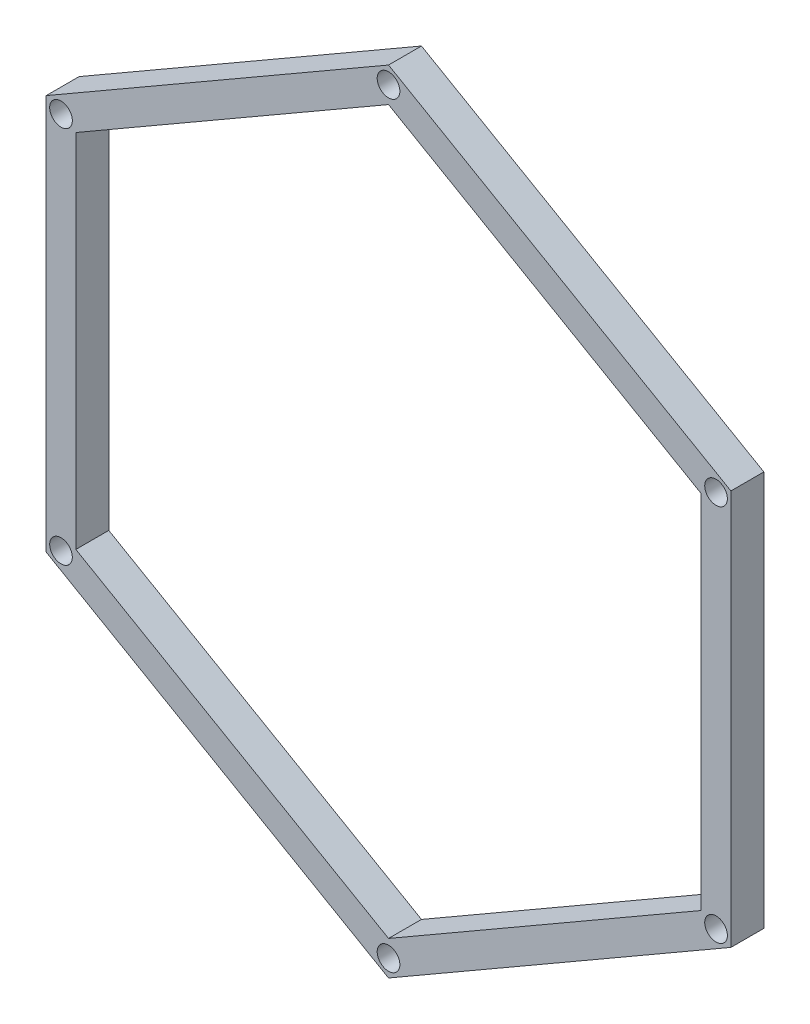
ISO-10303-21;
HEADER;
FILE_DESCRIPTION(('STEP AP214'),'2;1');
FILE_NAME('part.step','',(''),(''),'','','');
FILE_SCHEMA(('AUTOMOTIVE_DESIGN { 1 0 10303 214 1 1 1 1 }'));
ENDSEC;
DATA;
#1=APPLICATION_CONTEXT('core data for automotive mechanical design processes');
#2=APPLICATION_PROTOCOL_DEFINITION('international standard','automotive_design',2000,#1);
#3=PRODUCT_CONTEXT('',#1,'mechanical');
#4=PRODUCT('Part','Part','',(#3));
#5=PRODUCT_RELATED_PRODUCT_CATEGORY('part','',(#4));
#6=PRODUCT_DEFINITION_FORMATION('','',#4);
#7=PRODUCT_DEFINITION_CONTEXT('part definition',#1,'design');
#8=PRODUCT_DEFINITION('design','',#6,#7);
#9=PRODUCT_DEFINITION_SHAPE('','',#8);
#10=(LENGTH_UNIT() NAMED_UNIT(*) SI_UNIT(.MILLI.,.METRE.));
#11=(NAMED_UNIT(*) PLANE_ANGLE_UNIT() SI_UNIT($,.RADIAN.));
#12=(NAMED_UNIT(*) SI_UNIT($,.STERADIAN.) SOLID_ANGLE_UNIT());
#13=UNCERTAINTY_MEASURE_WITH_UNIT(LENGTH_MEASURE(1.E-05),#10,'distance_accuracy_value','');
#14=(GEOMETRIC_REPRESENTATION_CONTEXT(3) GLOBAL_UNCERTAINTY_ASSIGNED_CONTEXT((#13)) GLOBAL_UNIT_ASSIGNED_CONTEXT((#10,
#11,#12)) REPRESENTATION_CONTEXT('',''));
#15=CARTESIAN_POINT('',(0.,0.,0.));
#16=DIRECTION('',(0.,0.,1.));
#17=DIRECTION('',(1.,0.,0.));
#18=AXIS2_PLACEMENT_3D('',#15,#16,#17);
#19=CARTESIAN_POINT('',(0.,0.,3.175));
#20=DIRECTION('',(0.,0.,1.));
#21=DIRECTION('',(1.,0.,0.));
#22=AXIS2_PLACEMENT_3D('',#19,#20,#21);
#23=PLANE('',#22);
#24=CARTESIAN_POINT('',(0.,-36.449,3.175));
#25=DIRECTION('',(0.,0.,1.));
#26=DIRECTION('',(1.,0.,0.));
#27=AXIS2_PLACEMENT_3D('',#24,#25,#26);
#28=CIRCLE('',#27,1.0922);
#29=CARTESIAN_POINT('',(1.09220000000001,-36.449,3.175));
#30=VERTEX_POINT('',#29);
#31=EDGE_CURVE('E330',#30,#30,#28,.T.);
#32=ORIENTED_EDGE('',*,*,#31,.F.);
#33=EDGE_LOOP('',(#32));
#34=FACE_BOUND('',#33,.T.);
#35=CARTESIAN_POINT('',(31.565759942539,18.2245,3.175));
#36=DIRECTION('',(0.,0.,1.));
#37=DIRECTION('',(1.,0.,0.));
#38=AXIS2_PLACEMENT_3D('',#35,#36,#37);
#39=CIRCLE('',#38,1.09220000000001);
#40=CARTESIAN_POINT('',(32.657959942539,18.2245,3.175));
#41=VERTEX_POINT('',#40);
#42=EDGE_CURVE('E342',#41,#41,#39,.T.);
#43=ORIENTED_EDGE('',*,*,#42,.F.);
#44=EDGE_LOOP('',(#43));
#45=FACE_BOUND('',#44,.T.);
#46=DIRECTION('',(-0.866025403784439,0.5,0.));
#47=VECTOR('',#46,1.);
#48=CARTESIAN_POINT('',(30.1359520008909,17.399,3.175));
#49=LINE('',#48,#47);
#50=CARTESIAN_POINT('',(30.1359520008909,17.399,3.175));
#51=VERTEX_POINT('',#50);
#52=CARTESIAN_POINT('',(0.,34.798,3.175));
#53=VERTEX_POINT('',#52);
#54=EDGE_CURVE('E136',#51,#53,#49,.T.);
#55=ORIENTED_EDGE('',*,*,#54,.F.);
#56=DIRECTION('',(0.,1.,0.));
#57=VECTOR('',#56,1.);
#58=CARTESIAN_POINT('',(30.1359520008909,-17.399,3.175));
#59=LINE('',#58,#57);
#60=CARTESIAN_POINT('',(30.1359520008909,-17.399,3.175));
#61=VERTEX_POINT('',#60);
#62=EDGE_CURVE('E128',#61,#51,#59,.T.);
#63=ORIENTED_EDGE('',*,*,#62,.F.);
#64=DIRECTION('',(0.866025403784439,0.5,0.));
#65=VECTOR('',#64,1.);
#66=CARTESIAN_POINT('',(0.,-34.798,3.175));
#67=LINE('',#66,#65);
#68=CARTESIAN_POINT('',(0.,-34.798,3.175));
#69=VERTEX_POINT('',#68);
#70=EDGE_CURVE('E159',#69,#61,#67,.T.);
#71=ORIENTED_EDGE('',*,*,#70,.F.);
#72=DIRECTION('',(0.866025403784439,-0.5,0.));
#73=VECTOR('',#72,1.);
#74=CARTESIAN_POINT('',(-30.1359520008909,-17.399,3.175));
#75=LINE('',#74,#73);
#76=CARTESIAN_POINT('',(-30.1359520008909,-17.399,3.175));
#77=VERTEX_POINT('',#76);
#78=EDGE_CURVE('E157',#77,#69,#75,.T.);
#79=ORIENTED_EDGE('',*,*,#78,.F.);
#80=DIRECTION('',(0.,-1.,0.));
#81=VECTOR('',#80,1.);
#82=CARTESIAN_POINT('',(-30.1359520008909,17.399,3.175));
#83=LINE('',#82,#81);
#84=CARTESIAN_POINT('',(-30.1359520008909,17.399,3.175));
#85=VERTEX_POINT('',#84);
#86=EDGE_CURVE('E152',#85,#77,#83,.T.);
#87=ORIENTED_EDGE('',*,*,#86,.F.);
#88=DIRECTION('',(-0.866025403784439,-0.5,0.));
#89=VECTOR('',#88,1.);
#90=CARTESIAN_POINT('',(0.,34.798,3.175));
#91=LINE('',#90,#89);
#92=EDGE_CURVE('E150',#53,#85,#91,.T.);
#93=ORIENTED_EDGE('',*,*,#92,.F.);
#94=EDGE_LOOP('',(#55,#63,#71,#79,#87,#93));
#95=FACE_BOUND('',#94,.T.);
#96=CARTESIAN_POINT('',(-31.565759942539,18.2245,3.175));
#97=DIRECTION('',(0.,0.,1.));
#98=DIRECTION('',(1.,0.,0.));
#99=AXIS2_PLACEMENT_3D('',#96,#97,#98);
#100=CIRCLE('',#99,1.09220000000001);
#101=CARTESIAN_POINT('',(-30.473559942539,18.2245,3.175));
#102=VERTEX_POINT('',#101);
#103=EDGE_CURVE('E182',#102,#102,#100,.T.);
#104=ORIENTED_EDGE('',*,*,#103,.F.);
#105=EDGE_LOOP('',(#104));
#106=FACE_BOUND('',#105,.T.);
#107=DIRECTION('',(0.,1.,0.));
#108=VECTOR('',#107,1.);
#109=CARTESIAN_POINT('',(32.9955678841871,-19.05,3.175));
#110=LINE('',#109,#108);
#111=CARTESIAN_POINT('',(32.9955678841871,-19.05,3.175));
#112=VERTEX_POINT('',#111);
#113=CARTESIAN_POINT('',(32.9955678841871,19.05,3.175));
#114=VERTEX_POINT('',#113);
#115=EDGE_CURVE('E188',#112,#114,#110,.T.);
#116=ORIENTED_EDGE('',*,*,#115,.T.);
#117=DIRECTION('',(-0.866025403784439,0.5,0.));
#118=VECTOR('',#117,1.);
#119=CARTESIAN_POINT('',(32.9955678841871,19.05,3.175));
#120=LINE('',#119,#118);
#121=CARTESIAN_POINT('',(0.,38.1,3.175));
#122=VERTEX_POINT('',#121);
#123=EDGE_CURVE('E191',#114,#122,#120,.T.);
#124=ORIENTED_EDGE('',*,*,#123,.T.);
#125=DIRECTION('',(-0.866025403784438,-0.5,0.));
#126=VECTOR('',#125,1.);
#127=CARTESIAN_POINT('',(0.,38.1,3.175));
#128=LINE('',#127,#126);
#129=CARTESIAN_POINT('',(-32.9955678841871,19.05,3.175));
#130=VERTEX_POINT('',#129);
#131=EDGE_CURVE('E194',#122,#130,#128,.T.);
#132=ORIENTED_EDGE('',*,*,#131,.T.);
#133=DIRECTION('',(0.,-1.,0.));
#134=VECTOR('',#133,1.);
#135=CARTESIAN_POINT('',(-32.9955678841871,19.05,3.175));
#136=LINE('',#135,#134);
#137=CARTESIAN_POINT('',(-32.9955678841871,-19.05,3.175));
#138=VERTEX_POINT('',#137);
#139=EDGE_CURVE('E196',#130,#138,#136,.T.);
#140=ORIENTED_EDGE('',*,*,#139,.T.);
#141=DIRECTION('',(0.866025403784439,-0.5,0.));
#142=VECTOR('',#141,1.);
#143=CARTESIAN_POINT('',(-32.9955678841871,-19.05,3.175));
#144=LINE('',#143,#142);
#145=CARTESIAN_POINT('',(0.,-38.1,3.175));
#146=VERTEX_POINT('',#145);
#147=EDGE_CURVE('E198',#138,#146,#144,.T.);
#148=ORIENTED_EDGE('',*,*,#147,.T.);
#149=DIRECTION('',(0.866025403784438,0.5,0.));
#150=VECTOR('',#149,1.);
#151=CARTESIAN_POINT('',(0.,-38.1,3.175));
#152=LINE('',#151,#150);
#153=EDGE_CURVE('E200',#146,#112,#152,.T.);
#154=ORIENTED_EDGE('',*,*,#153,.T.);
#155=EDGE_LOOP('',(#116,#124,#132,#140,#148,#154));
#156=FACE_BOUND('',#155,.T.);
#157=CARTESIAN_POINT('',(0.,36.449,3.175));
#158=DIRECTION('',(0.,0.,1.));
#159=DIRECTION('',(1.,0.,0.));
#160=AXIS2_PLACEMENT_3D('',#157,#158,#159);
#161=CIRCLE('',#160,1.0922);
#162=CARTESIAN_POINT('',(1.09220000000001,36.449,3.175));
#163=VERTEX_POINT('',#162);
#164=EDGE_CURVE('E162',#163,#163,#161,.T.);
#165=ORIENTED_EDGE('',*,*,#164,.F.);
#166=EDGE_LOOP('',(#165));
#167=FACE_BOUND('',#166,.T.);
#168=CARTESIAN_POINT('',(31.565759942539,-18.2245,3.175));
#169=DIRECTION('',(0.,0.,1.));
#170=DIRECTION('',(1.,0.,0.));
#171=AXIS2_PLACEMENT_3D('',#168,#169,#170);
#172=CIRCLE('',#171,1.0922);
#173=CARTESIAN_POINT('',(32.657959942539,-18.2245,3.175));
#174=VERTEX_POINT('',#173);
#175=EDGE_CURVE('E336',#174,#174,#172,.T.);
#176=ORIENTED_EDGE('',*,*,#175,.F.);
#177=EDGE_LOOP('',(#176));
#178=FACE_BOUND('',#177,.T.);
#179=CARTESIAN_POINT('',(-31.565759942539,-18.2245,3.175));
#180=DIRECTION('',(0.,0.,1.));
#181=DIRECTION('',(1.,0.,0.));
#182=AXIS2_PLACEMENT_3D('',#179,#180,#181);
#183=CIRCLE('',#182,1.09220000000001);
#184=CARTESIAN_POINT('',(-30.473559942539,-18.2245,3.175));
#185=VERTEX_POINT('',#184);
#186=EDGE_CURVE('E321',#185,#185,#183,.T.);
#187=ORIENTED_EDGE('',*,*,#186,.F.);
#188=EDGE_LOOP('',(#187));
#189=FACE_BOUND('',#188,.T.);
#190=ADVANCED_FACE('F39',(#34,#45,#95,#106,#156,#167,#178,#189),#23,.T.);
#191=CARTESIAN_POINT('',(0.,0.,0.));
#192=DIRECTION('',(0.,0.,1.));
#193=DIRECTION('',(1.,0.,0.));
#194=AXIS2_PLACEMENT_3D('',#191,#192,#193);
#195=PLANE('',#194);
#196=CARTESIAN_POINT('',(-31.565759942539,18.2245,0.));
#197=DIRECTION('',(0.,0.,1.));
#198=DIRECTION('',(1.,0.,0.));
#199=AXIS2_PLACEMENT_3D('',#196,#197,#198);
#200=CIRCLE('',#199,1.09220000000001);
#201=CARTESIAN_POINT('',(-30.473559942539,18.2245,0.));
#202=VERTEX_POINT('',#201);
#203=EDGE_CURVE('E144',#202,#202,#200,.T.);
#204=ORIENTED_EDGE('',*,*,#203,.T.);
#205=EDGE_LOOP('',(#204));
#206=FACE_BOUND('',#205,.T.);
#207=DIRECTION('',(0.,1.,0.));
#208=VECTOR('',#207,1.);
#209=CARTESIAN_POINT('',(32.9955678841871,-19.05,0.));
#210=LINE('',#209,#208);
#211=CARTESIAN_POINT('',(32.9955678841871,-19.05,0.));
#212=VERTEX_POINT('',#211);
#213=CARTESIAN_POINT('',(32.9955678841871,19.05,0.));
#214=VERTEX_POINT('',#213);
#215=EDGE_CURVE('E185',#212,#214,#210,.T.);
#216=ORIENTED_EDGE('',*,*,#215,.F.);
#217=DIRECTION('',(0.866025403784438,0.5,0.));
#218=VECTOR('',#217,1.);
#219=CARTESIAN_POINT('',(0.,-38.1,0.));
#220=LINE('',#219,#218);
#221=CARTESIAN_POINT('',(0.,-38.1,0.));
#222=VERTEX_POINT('',#221);
#223=EDGE_CURVE('E192',#222,#212,#220,.T.);
#224=ORIENTED_EDGE('',*,*,#223,.F.);
#225=DIRECTION('',(0.866025403784439,-0.5,0.));
#226=VECTOR('',#225,1.);
#227=CARTESIAN_POINT('',(-32.9955678841871,-19.05,0.));
#228=LINE('',#227,#226);
#229=CARTESIAN_POINT('',(-32.9955678841871,-19.05,0.));
#230=VERTEX_POINT('',#229);
#231=EDGE_CURVE('E211',#230,#222,#228,.T.);
#232=ORIENTED_EDGE('',*,*,#231,.F.);
#233=DIRECTION('',(0.,-1.,0.));
#234=VECTOR('',#233,1.);
#235=CARTESIAN_POINT('',(-32.9955678841871,19.05,0.));
#236=LINE('',#235,#234);
#237=CARTESIAN_POINT('',(-32.9955678841871,19.05,0.));
#238=VERTEX_POINT('',#237);
#239=EDGE_CURVE('E209',#238,#230,#236,.T.);
#240=ORIENTED_EDGE('',*,*,#239,.F.);
#241=DIRECTION('',(-0.866025403784438,-0.5,0.));
#242=VECTOR('',#241,1.);
#243=CARTESIAN_POINT('',(0.,38.1,0.));
#244=LINE('',#243,#242);
#245=CARTESIAN_POINT('',(0.,38.1,0.));
#246=VERTEX_POINT('',#245);
#247=EDGE_CURVE('E207',#246,#238,#244,.T.);
#248=ORIENTED_EDGE('',*,*,#247,.F.);
#249=DIRECTION('',(-0.866025403784439,0.5,0.));
#250=VECTOR('',#249,1.);
#251=CARTESIAN_POINT('',(32.9955678841871,19.05,0.));
#252=LINE('',#251,#250);
#253=EDGE_CURVE('E205',#214,#246,#252,.T.);
#254=ORIENTED_EDGE('',*,*,#253,.F.);
#255=EDGE_LOOP('',(#216,#224,#232,#240,#248,#254));
#256=FACE_BOUND('',#255,.T.);
#257=DIRECTION('',(0.,1.,0.));
#258=VECTOR('',#257,1.);
#259=CARTESIAN_POINT('',(30.1359520008909,-17.399,0.));
#260=LINE('',#259,#258);
#261=CARTESIAN_POINT('',(30.1359520008909,-17.399,0.));
#262=VERTEX_POINT('',#261);
#263=CARTESIAN_POINT('',(30.1359520008909,17.399,0.));
#264=VERTEX_POINT('',#263);
#265=EDGE_CURVE('E62',#262,#264,#260,.T.);
#266=ORIENTED_EDGE('',*,*,#265,.T.);
#267=DIRECTION('',(-0.866025403784439,0.5,0.));
#268=VECTOR('',#267,1.);
#269=CARTESIAN_POINT('',(30.1359520008909,17.399,0.));
#270=LINE('',#269,#268);
#271=CARTESIAN_POINT('',(0.,34.798,0.));
#272=VERTEX_POINT('',#271);
#273=EDGE_CURVE('E143',#264,#272,#270,.T.);
#274=ORIENTED_EDGE('',*,*,#273,.T.);
#275=DIRECTION('',(-0.866025403784439,-0.5,0.));
#276=VECTOR('',#275,1.);
#277=CARTESIAN_POINT('',(0.,34.798,0.));
#278=LINE('',#277,#276);
#279=CARTESIAN_POINT('',(-30.1359520008909,17.399,0.));
#280=VERTEX_POINT('',#279);
#281=EDGE_CURVE('E164',#272,#280,#278,.T.);
#282=ORIENTED_EDGE('',*,*,#281,.T.);
#283=DIRECTION('',(0.,-1.,0.));
#284=VECTOR('',#283,1.);
#285=CARTESIAN_POINT('',(-30.1359520008909,17.399,0.));
#286=LINE('',#285,#284);
#287=CARTESIAN_POINT('',(-30.1359520008909,-17.399,0.));
#288=VERTEX_POINT('',#287);
#289=EDGE_CURVE('E167',#280,#288,#286,.T.);
#290=ORIENTED_EDGE('',*,*,#289,.T.);
#291=DIRECTION('',(0.866025403784439,-0.5,0.));
#292=VECTOR('',#291,1.);
#293=CARTESIAN_POINT('',(-30.1359520008909,-17.399,0.));
#294=LINE('',#293,#292);
#295=CARTESIAN_POINT('',(0.,-34.798,0.));
#296=VERTEX_POINT('',#295);
#297=EDGE_CURVE('E170',#288,#296,#294,.T.);
#298=ORIENTED_EDGE('',*,*,#297,.T.);
#299=DIRECTION('',(0.866025403784439,0.5,0.));
#300=VECTOR('',#299,1.);
#301=CARTESIAN_POINT('',(0.,-34.798,0.));
#302=LINE('',#301,#300);
#303=EDGE_CURVE('E137',#296,#262,#302,.T.);
#304=ORIENTED_EDGE('',*,*,#303,.T.);
#305=EDGE_LOOP('',(#266,#274,#282,#290,#298,#304));
#306=FACE_BOUND('',#305,.T.);
#307=CARTESIAN_POINT('',(0.,36.449,0.));
#308=DIRECTION('',(0.,0.,1.));
#309=DIRECTION('',(1.,0.,0.));
#310=AXIS2_PLACEMENT_3D('',#307,#308,#309);
#311=CIRCLE('',#310,1.0922);
#312=CARTESIAN_POINT('',(1.09220000000001,36.449,0.));
#313=VERTEX_POINT('',#312);
#314=EDGE_CURVE('E345',#313,#313,#311,.T.);
#315=ORIENTED_EDGE('',*,*,#314,.T.);
#316=EDGE_LOOP('',(#315));
#317=FACE_BOUND('',#316,.T.);
#318=CARTESIAN_POINT('',(31.565759942539,18.2245,0.));
#319=DIRECTION('',(0.,0.,1.));
#320=DIRECTION('',(1.,0.,0.));
#321=AXIS2_PLACEMENT_3D('',#318,#319,#320);
#322=CIRCLE('',#321,1.09220000000001);
#323=CARTESIAN_POINT('',(32.657959942539,18.2245,0.));
#324=VERTEX_POINT('',#323);
#325=EDGE_CURVE('E339',#324,#324,#322,.T.);
#326=ORIENTED_EDGE('',*,*,#325,.T.);
#327=EDGE_LOOP('',(#326));
#328=FACE_BOUND('',#327,.T.);
#329=CARTESIAN_POINT('',(31.565759942539,-18.2245,0.));
#330=DIRECTION('',(0.,0.,1.));
#331=DIRECTION('',(1.,0.,0.));
#332=AXIS2_PLACEMENT_3D('',#329,#330,#331);
#333=CIRCLE('',#332,1.0922);
#334=CARTESIAN_POINT('',(32.657959942539,-18.2245,0.));
#335=VERTEX_POINT('',#334);
#336=EDGE_CURVE('E333',#335,#335,#333,.T.);
#337=ORIENTED_EDGE('',*,*,#336,.T.);
#338=EDGE_LOOP('',(#337));
#339=FACE_BOUND('',#338,.T.);
#340=CARTESIAN_POINT('',(0.,-36.449,0.));
#341=DIRECTION('',(0.,0.,1.));
#342=DIRECTION('',(1.,0.,0.));
#343=AXIS2_PLACEMENT_3D('',#340,#341,#342);
#344=CIRCLE('',#343,1.0922);
#345=CARTESIAN_POINT('',(1.09220000000001,-36.449,0.));
#346=VERTEX_POINT('',#345);
#347=EDGE_CURVE('E327',#346,#346,#344,.T.);
#348=ORIENTED_EDGE('',*,*,#347,.T.);
#349=EDGE_LOOP('',(#348));
#350=FACE_BOUND('',#349,.T.);
#351=CARTESIAN_POINT('',(-31.565759942539,-18.2245,0.));
#352=DIRECTION('',(0.,0.,1.));
#353=DIRECTION('',(1.,0.,0.));
#354=AXIS2_PLACEMENT_3D('',#351,#352,#353);
#355=CIRCLE('',#354,1.09220000000001);
#356=CARTESIAN_POINT('',(-30.473559942539,-18.2245,0.));
#357=VERTEX_POINT('',#356);
#358=EDGE_CURVE('E324',#357,#357,#355,.T.);
#359=ORIENTED_EDGE('',*,*,#358,.T.);
#360=EDGE_LOOP('',(#359));
#361=FACE_BOUND('',#360,.T.);
#362=ADVANCED_FACE('F235',(#206,#256,#306,#317,#328,#339,#350,#361),#195,.F.);
#363=CARTESIAN_POINT('',(32.9955678841871,-19.05,3.175));
#364=DIRECTION('',(-1.,0.,0.));
#365=DIRECTION('',(0.,-1.,0.));
#366=AXIS2_PLACEMENT_3D('',#363,#364,#365);
#367=PLANE('',#366);
#368=ORIENTED_EDGE('',*,*,#215,.T.);
#369=DIRECTION('',(0.,0.,-1.));
#370=VECTOR('',#369,1.);
#371=CARTESIAN_POINT('',(32.9955678841871,19.05,3.175));
#372=LINE('',#371,#370);
#373=EDGE_CURVE('E11',#114,#214,#372,.T.);
#374=ORIENTED_EDGE('',*,*,#373,.F.);
#375=ORIENTED_EDGE('',*,*,#115,.F.);
#376=DIRECTION('',(0.,0.,-1.));
#377=VECTOR('',#376,1.);
#378=CARTESIAN_POINT('',(32.9955678841871,-19.05,3.175));
#379=LINE('',#378,#377);
#380=EDGE_CURVE('E202',#112,#212,#379,.T.);
#381=ORIENTED_EDGE('',*,*,#380,.T.);
#382=EDGE_LOOP('',(#368,#374,#375,#381));
#383=FACE_BOUND('',#382,.T.);
#384=ADVANCED_FACE('F41',(#383),#367,.F.);
#385=CARTESIAN_POINT('',(32.9955678841871,19.05,3.175));
#386=DIRECTION('',(-0.5,-0.866025403784439,0.));
#387=DIRECTION('',(0.866025403784439,-0.5,0.));
#388=AXIS2_PLACEMENT_3D('',#385,#386,#387);
#389=PLANE('',#388);
#390=ORIENTED_EDGE('',*,*,#253,.T.);
#391=DIRECTION('',(0.,0.,-1.));
#392=VECTOR('',#391,1.);
#393=CARTESIAN_POINT('',(0.,38.1,3.175));
#394=LINE('',#393,#392);
#395=EDGE_CURVE('E47',#122,#246,#394,.T.);
#396=ORIENTED_EDGE('',*,*,#395,.F.);
#397=ORIENTED_EDGE('',*,*,#123,.F.);
#398=ORIENTED_EDGE('',*,*,#373,.T.);
#399=EDGE_LOOP('',(#390,#396,#397,#398));
#400=FACE_BOUND('',#399,.T.);
#401=ADVANCED_FACE('F253',(#400),#389,.F.);
#402=CARTESIAN_POINT('',(0.,38.1,3.175));
#403=DIRECTION('',(0.5,-0.866025403784438,0.));
#404=DIRECTION('',(0.866025403784438,0.5,0.));
#405=AXIS2_PLACEMENT_3D('',#402,#403,#404);
#406=PLANE('',#405);
#407=ORIENTED_EDGE('',*,*,#247,.T.);
#408=DIRECTION('',(0.,0.,-1.));
#409=VECTOR('',#408,1.);
#410=CARTESIAN_POINT('',(-32.9955678841871,19.05,3.175));
#411=LINE('',#410,#409);
#412=EDGE_CURVE('E222',#130,#238,#411,.T.);
#413=ORIENTED_EDGE('',*,*,#412,.F.);
#414=ORIENTED_EDGE('',*,*,#131,.F.);
#415=ORIENTED_EDGE('',*,*,#395,.T.);
#416=EDGE_LOOP('',(#407,#413,#414,#415));
#417=FACE_BOUND('',#416,.T.);
#418=ADVANCED_FACE('F229',(#417),#406,.F.);
#419=CARTESIAN_POINT('',(-32.9955678841871,19.05,3.175));
#420=DIRECTION('',(1.,0.,0.));
#421=DIRECTION('',(0.,1.,0.));
#422=AXIS2_PLACEMENT_3D('',#419,#420,#421);
#423=PLANE('',#422);
#424=ORIENTED_EDGE('',*,*,#239,.T.);
#425=DIRECTION('',(0.,0.,-1.));
#426=VECTOR('',#425,1.);
#427=CARTESIAN_POINT('',(-32.9955678841871,-19.05,3.175));
#428=LINE('',#427,#426);
#429=EDGE_CURVE('E219',#138,#230,#428,.T.);
#430=ORIENTED_EDGE('',*,*,#429,.F.);
#431=ORIENTED_EDGE('',*,*,#139,.F.);
#432=ORIENTED_EDGE('',*,*,#412,.T.);
#433=EDGE_LOOP('',(#424,#430,#431,#432));
#434=FACE_BOUND('',#433,.T.);
#435=ADVANCED_FACE('F241',(#434),#423,.F.);
#436=CARTESIAN_POINT('',(-32.9955678841871,-19.05,3.175));
#437=DIRECTION('',(0.5,0.866025403784439,0.));
#438=DIRECTION('',(-0.866025403784439,0.5,0.));
#439=AXIS2_PLACEMENT_3D('',#436,#437,#438);
#440=PLANE('',#439);
#441=ORIENTED_EDGE('',*,*,#231,.T.);
#442=DIRECTION('',(0.,0.,-1.));
#443=VECTOR('',#442,1.);
#444=CARTESIAN_POINT('',(0.,-38.1,3.175));
#445=LINE('',#444,#443);
#446=EDGE_CURVE('E216',#146,#222,#445,.T.);
#447=ORIENTED_EDGE('',*,*,#446,.F.);
#448=ORIENTED_EDGE('',*,*,#147,.F.);
#449=ORIENTED_EDGE('',*,*,#429,.T.);
#450=EDGE_LOOP('',(#441,#447,#448,#449));
#451=FACE_BOUND('',#450,.T.);
#452=ADVANCED_FACE('F245',(#451),#440,.F.);
#453=CARTESIAN_POINT('',(0.,-38.1,3.175));
#454=DIRECTION('',(-0.5,0.866025403784439,0.));
#455=DIRECTION('',(-0.866025403784439,-0.5,0.));
#456=AXIS2_PLACEMENT_3D('',#453,#454,#455);
#457=PLANE('',#456);
#458=ORIENTED_EDGE('',*,*,#223,.T.);
#459=ORIENTED_EDGE('',*,*,#380,.F.);
#460=ORIENTED_EDGE('',*,*,#153,.F.);
#461=ORIENTED_EDGE('',*,*,#446,.T.);
#462=EDGE_LOOP('',(#458,#459,#460,#461));
#463=FACE_BOUND('',#462,.T.);
#464=ADVANCED_FACE('F256',(#463),#457,.F.);
#465=CARTESIAN_POINT('',(-31.565759942539,18.2245,3.175));
#466=DIRECTION('',(0.,0.,-1.));
#467=DIRECTION('',(-1.,0.,0.));
#468=AXIS2_PLACEMENT_3D('',#465,#466,#467);
#469=CYLINDRICAL_SURFACE('',#468,1.09220000000001);
#470=ORIENTED_EDGE('',*,*,#103,.T.);
#471=EDGE_LOOP('',(#470));
#472=FACE_BOUND('',#471,.T.);
#473=ORIENTED_EDGE('',*,*,#203,.F.);
#474=EDGE_LOOP('',(#473));
#475=FACE_BOUND('',#474,.T.);
#476=ADVANCED_FACE('F258',(#472,#475),#469,.F.);
#477=CARTESIAN_POINT('',(30.1359520008909,-17.399,3.175));
#478=DIRECTION('',(-1.,0.,0.));
#479=DIRECTION('',(0.,-1.,0.));
#480=AXIS2_PLACEMENT_3D('',#477,#478,#479);
#481=PLANE('',#480);
#482=ORIENTED_EDGE('',*,*,#265,.F.);
#483=DIRECTION('',(0.,0.,-1.));
#484=VECTOR('',#483,1.);
#485=CARTESIAN_POINT('',(30.1359520008909,-17.399,3.175));
#486=LINE('',#485,#484);
#487=EDGE_CURVE('E132',#61,#262,#486,.T.);
#488=ORIENTED_EDGE('',*,*,#487,.F.);
#489=ORIENTED_EDGE('',*,*,#62,.T.);
#490=DIRECTION('',(0.,0.,-1.));
#491=VECTOR('',#490,1.);
#492=CARTESIAN_POINT('',(30.1359520008909,17.399,3.175));
#493=LINE('',#492,#491);
#494=EDGE_CURVE('E131',#51,#264,#493,.T.);
#495=ORIENTED_EDGE('',*,*,#494,.T.);
#496=EDGE_LOOP('',(#482,#488,#489,#495));
#497=FACE_BOUND('',#496,.T.);
#498=ADVANCED_FACE('F130',(#497),#481,.T.);
#499=CARTESIAN_POINT('',(30.1359520008909,17.399,3.175));
#500=DIRECTION('',(-0.5,-0.866025403784439,0.));
#501=DIRECTION('',(0.866025403784439,-0.5,0.));
#502=AXIS2_PLACEMENT_3D('',#499,#500,#501);
#503=PLANE('',#502);
#504=ORIENTED_EDGE('',*,*,#273,.F.);
#505=ORIENTED_EDGE('',*,*,#494,.F.);
#506=ORIENTED_EDGE('',*,*,#54,.T.);
#507=DIRECTION('',(0.,0.,-1.));
#508=VECTOR('',#507,1.);
#509=CARTESIAN_POINT('',(0.,34.798,3.175));
#510=LINE('',#509,#508);
#511=EDGE_CURVE('E145',#53,#272,#510,.T.);
#512=ORIENTED_EDGE('',*,*,#511,.T.);
#513=EDGE_LOOP('',(#504,#505,#506,#512));
#514=FACE_BOUND('',#513,.T.);
#515=ADVANCED_FACE('F140',(#514),#503,.T.);
#516=CARTESIAN_POINT('',(0.,34.798,3.175));
#517=DIRECTION('',(0.5,-0.866025403784439,0.));
#518=DIRECTION('',(0.866025403784439,0.5,0.));
#519=AXIS2_PLACEMENT_3D('',#516,#517,#518);
#520=PLANE('',#519);
#521=ORIENTED_EDGE('',*,*,#281,.F.);
#522=ORIENTED_EDGE('',*,*,#511,.F.);
#523=ORIENTED_EDGE('',*,*,#92,.T.);
#524=DIRECTION('',(0.,0.,-1.));
#525=VECTOR('',#524,1.);
#526=CARTESIAN_POINT('',(-30.1359520008909,17.399,3.175));
#527=LINE('',#526,#525);
#528=EDGE_CURVE('E179',#85,#280,#527,.T.);
#529=ORIENTED_EDGE('',*,*,#528,.T.);
#530=EDGE_LOOP('',(#521,#522,#523,#529));
#531=FACE_BOUND('',#530,.T.);
#532=ADVANCED_FACE('F282',(#531),#520,.T.);
#533=CARTESIAN_POINT('',(-30.1359520008909,17.399,3.175));
#534=DIRECTION('',(1.,0.,0.));
#535=DIRECTION('',(0.,1.,0.));
#536=AXIS2_PLACEMENT_3D('',#533,#534,#535);
#537=PLANE('',#536);
#538=ORIENTED_EDGE('',*,*,#289,.F.);
#539=ORIENTED_EDGE('',*,*,#528,.F.);
#540=ORIENTED_EDGE('',*,*,#86,.T.);
#541=DIRECTION('',(0.,0.,-1.));
#542=VECTOR('',#541,1.);
#543=CARTESIAN_POINT('',(-30.1359520008909,-17.399,3.175));
#544=LINE('',#543,#542);
#545=EDGE_CURVE('E177',#77,#288,#544,.T.);
#546=ORIENTED_EDGE('',*,*,#545,.T.);
#547=EDGE_LOOP('',(#538,#539,#540,#546));
#548=FACE_BOUND('',#547,.T.);
#549=ADVANCED_FACE('F285',(#548),#537,.T.);
#550=CARTESIAN_POINT('',(-30.1359520008909,-17.399,3.175));
#551=DIRECTION('',(0.5,0.866025403784439,0.));
#552=DIRECTION('',(-0.866025403784439,0.5,0.));
#553=AXIS2_PLACEMENT_3D('',#550,#551,#552);
#554=PLANE('',#553);
#555=ORIENTED_EDGE('',*,*,#297,.F.);
#556=ORIENTED_EDGE('',*,*,#545,.F.);
#557=ORIENTED_EDGE('',*,*,#78,.T.);
#558=DIRECTION('',(0.,0.,-1.));
#559=VECTOR('',#558,1.);
#560=CARTESIAN_POINT('',(0.,-34.798,3.175));
#561=LINE('',#560,#559);
#562=EDGE_CURVE('E54',#69,#296,#561,.T.);
#563=ORIENTED_EDGE('',*,*,#562,.T.);
#564=EDGE_LOOP('',(#555,#556,#557,#563));
#565=FACE_BOUND('',#564,.T.);
#566=ADVANCED_FACE('F289',(#565),#554,.T.);
#567=CARTESIAN_POINT('',(0.,-34.798,3.175));
#568=DIRECTION('',(-0.5,0.866025403784439,0.));
#569=DIRECTION('',(-0.866025403784439,-0.5,0.));
#570=AXIS2_PLACEMENT_3D('',#567,#568,#569);
#571=PLANE('',#570);
#572=ORIENTED_EDGE('',*,*,#303,.F.);
#573=ORIENTED_EDGE('',*,*,#562,.F.);
#574=ORIENTED_EDGE('',*,*,#70,.T.);
#575=ORIENTED_EDGE('',*,*,#487,.T.);
#576=EDGE_LOOP('',(#572,#573,#574,#575));
#577=FACE_BOUND('',#576,.T.);
#578=ADVANCED_FACE('F293',(#577),#571,.T.);
#579=CARTESIAN_POINT('',(0.,36.449,3.175));
#580=DIRECTION('',(0.,0.,-1.));
#581=DIRECTION('',(-1.,0.,0.));
#582=AXIS2_PLACEMENT_3D('',#579,#580,#581);
#583=CYLINDRICAL_SURFACE('',#582,1.0922);
#584=ORIENTED_EDGE('',*,*,#164,.T.);
#585=EDGE_LOOP('',(#584));
#586=FACE_BOUND('',#585,.T.);
#587=ORIENTED_EDGE('',*,*,#314,.F.);
#588=EDGE_LOOP('',(#587));
#589=FACE_BOUND('',#588,.T.);
#590=ADVANCED_FACE('F297',(#586,#589),#583,.F.);
#591=CARTESIAN_POINT('',(31.565759942539,18.2245,3.175));
#592=DIRECTION('',(0.,0.,-1.));
#593=DIRECTION('',(-1.,0.,0.));
#594=AXIS2_PLACEMENT_3D('',#591,#592,#593);
#595=CYLINDRICAL_SURFACE('',#594,1.09220000000001);
#596=ORIENTED_EDGE('',*,*,#42,.T.);
#597=EDGE_LOOP('',(#596));
#598=FACE_BOUND('',#597,.T.);
#599=ORIENTED_EDGE('',*,*,#325,.F.);
#600=EDGE_LOOP('',(#599));
#601=FACE_BOUND('',#600,.T.);
#602=ADVANCED_FACE('F300',(#598,#601),#595,.F.);
#603=CARTESIAN_POINT('',(31.565759942539,-18.2245,3.175));
#604=DIRECTION('',(0.,0.,-1.));
#605=DIRECTION('',(-1.,0.,0.));
#606=AXIS2_PLACEMENT_3D('',#603,#604,#605);
#607=CYLINDRICAL_SURFACE('',#606,1.0922);
#608=ORIENTED_EDGE('',*,*,#175,.T.);
#609=EDGE_LOOP('',(#608));
#610=FACE_BOUND('',#609,.T.);
#611=ORIENTED_EDGE('',*,*,#336,.F.);
#612=EDGE_LOOP('',(#611));
#613=FACE_BOUND('',#612,.T.);
#614=ADVANCED_FACE('F304',(#610,#613),#607,.F.);
#615=CARTESIAN_POINT('',(0.,-36.449,3.175));
#616=DIRECTION('',(0.,0.,-1.));
#617=DIRECTION('',(-1.,0.,0.));
#618=AXIS2_PLACEMENT_3D('',#615,#616,#617);
#619=CYLINDRICAL_SURFACE('',#618,1.0922);
#620=ORIENTED_EDGE('',*,*,#31,.T.);
#621=EDGE_LOOP('',(#620));
#622=FACE_BOUND('',#621,.T.);
#623=ORIENTED_EDGE('',*,*,#347,.F.);
#624=EDGE_LOOP('',(#623));
#625=FACE_BOUND('',#624,.T.);
#626=ADVANCED_FACE('F308',(#622,#625),#619,.F.);
#627=CARTESIAN_POINT('',(-31.565759942539,-18.2245,3.175));
#628=DIRECTION('',(0.,0.,-1.));
#629=DIRECTION('',(-1.,0.,0.));
#630=AXIS2_PLACEMENT_3D('',#627,#628,#629);
#631=CYLINDRICAL_SURFACE('',#630,1.09220000000001);
#632=ORIENTED_EDGE('',*,*,#186,.T.);
#633=EDGE_LOOP('',(#632));
#634=FACE_BOUND('',#633,.T.);
#635=ORIENTED_EDGE('',*,*,#358,.F.);
#636=EDGE_LOOP('',(#635));
#637=FACE_BOUND('',#636,.T.);
#638=ADVANCED_FACE('F312',(#634,#637),#631,.F.);
#639=CLOSED_SHELL('',(#190,#362,#384,#401,#418,#435,#452,#464,#476,#498,#515,#532,#549,#566,
#578,#590,#602,#614,#626,#638));
#640=MANIFOLD_SOLID_BREP('B2',#639);
#641=ADVANCED_BREP_SHAPE_REPRESENTATION('',(#18,#640),#14);
#642=SHAPE_DEFINITION_REPRESENTATION(#9,#641);
ENDSEC;
END-ISO-10303-21;
